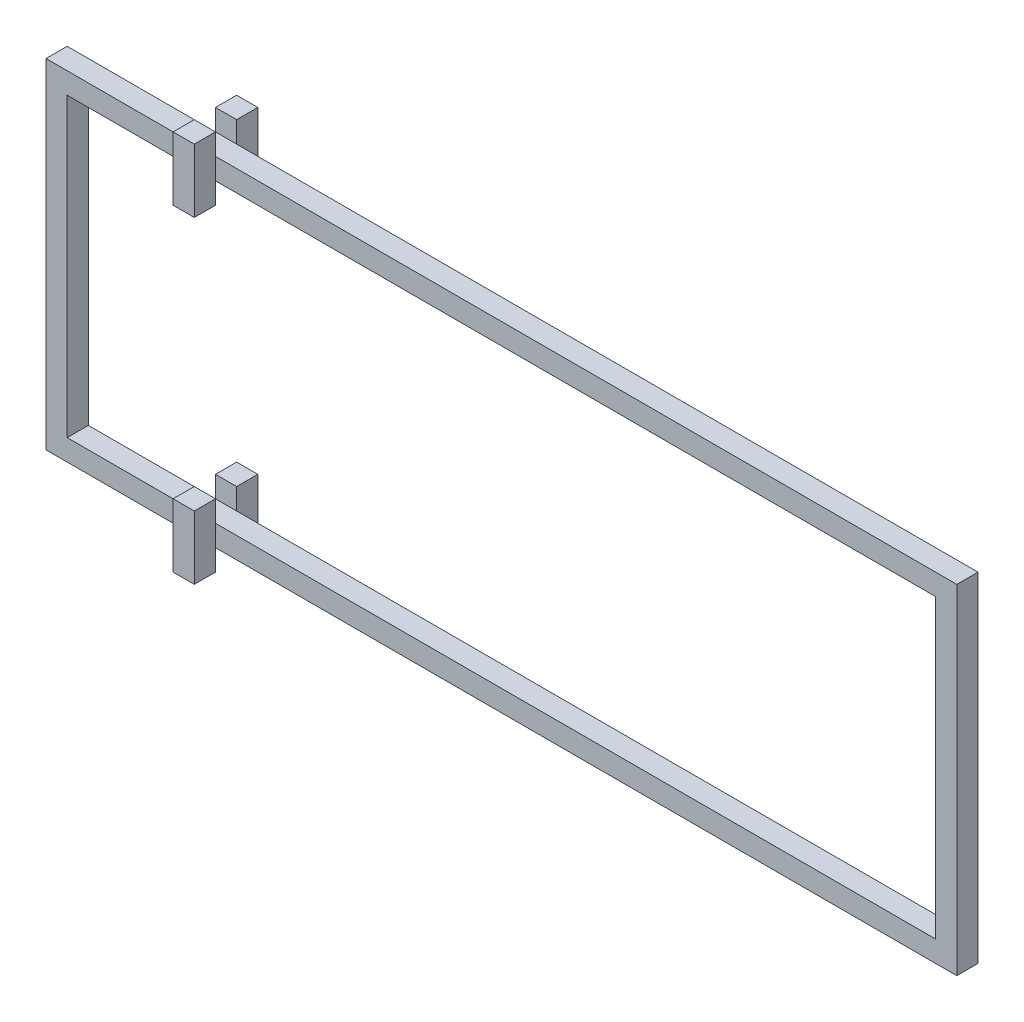
ISO-10303-21;
HEADER;
FILE_DESCRIPTION(('STEP AP214'),'2;1');
FILE_NAME('part.step','',(''),(''),'','','');
FILE_SCHEMA(('AUTOMOTIVE_DESIGN { 1 0 10303 214 1 1 1 1 }'));
ENDSEC;
DATA;
#1=APPLICATION_CONTEXT('core data for automotive mechanical design processes');
#2=APPLICATION_PROTOCOL_DEFINITION('international standard','automotive_design',2000,#1);
#3=PRODUCT_CONTEXT('',#1,'mechanical');
#4=PRODUCT('Part','Part','',(#3));
#5=PRODUCT_RELATED_PRODUCT_CATEGORY('part','',(#4));
#6=PRODUCT_DEFINITION_FORMATION('','',#4);
#7=PRODUCT_DEFINITION_CONTEXT('part definition',#1,'design');
#8=PRODUCT_DEFINITION('design','',#6,#7);
#9=PRODUCT_DEFINITION_SHAPE('','',#8);
#10=(LENGTH_UNIT() NAMED_UNIT(*) SI_UNIT(.MILLI.,.METRE.));
#11=(NAMED_UNIT(*) PLANE_ANGLE_UNIT() SI_UNIT($,.RADIAN.));
#12=(NAMED_UNIT(*) SI_UNIT($,.STERADIAN.) SOLID_ANGLE_UNIT());
#13=UNCERTAINTY_MEASURE_WITH_UNIT(LENGTH_MEASURE(1.E-05),#10,'distance_accuracy_value','');
#14=(GEOMETRIC_REPRESENTATION_CONTEXT(3) GLOBAL_UNCERTAINTY_ASSIGNED_CONTEXT((#13)) GLOBAL_UNIT_ASSIGNED_CONTEXT((#10,
#11,#12)) REPRESENTATION_CONTEXT('',''));
#15=CARTESIAN_POINT('',(0.,0.,0.));
#16=DIRECTION('',(0.,0.,1.));
#17=DIRECTION('',(1.,0.,0.));
#18=AXIS2_PLACEMENT_3D('',#15,#16,#17);
#19=CARTESIAN_POINT('',(-106.68,38.1,2.54));
#20=DIRECTION('',(0.,-1.,0.));
#21=DIRECTION('',(0.,0.,-1.));
#22=AXIS2_PLACEMENT_3D('',#19,#20,#21);
#23=PLANE('',#22);
#24=DIRECTION('',(-1.,0.,0.));
#25=VECTOR('',#24,1.);
#26=CARTESIAN_POINT('',(-106.68,38.1,2.54));
#27=LINE('',#26,#25);
#28=CARTESIAN_POINT('',(-2.54,38.1,2.54));
#29=VERTEX_POINT('',#28);
#30=CARTESIAN_POINT('',(-88.9,38.1,2.54));
#31=VERTEX_POINT('',#30);
#32=EDGE_CURVE('E534',#29,#31,#27,.T.);
#33=ORIENTED_EDGE('',*,*,#32,.T.);
#34=DIRECTION('',(1.,0.,0.));
#35=VECTOR('',#34,1.);
#36=CARTESIAN_POINT('',(-88.9,38.1,2.54));
#37=LINE('',#36,#35);
#38=CARTESIAN_POINT('',(-91.44,38.1,2.54));
#39=VERTEX_POINT('',#38);
#40=EDGE_CURVE('E366',#39,#31,#37,.T.);
#41=ORIENTED_EDGE('',*,*,#40,.F.);
#42=CARTESIAN_POINT('',(-106.68,38.1,2.54));
#43=VERTEX_POINT('',#42);
#44=EDGE_CURVE('E533',#39,#43,#27,.T.);
#45=ORIENTED_EDGE('',*,*,#44,.T.);
#46=DIRECTION('',(0.,0.,-1.));
#47=VECTOR('',#46,1.);
#48=CARTESIAN_POINT('',(-106.68,38.1,2.54));
#49=LINE('',#48,#47);
#50=CARTESIAN_POINT('',(-106.68,38.1,0.));
#51=VERTEX_POINT('',#50);
#52=EDGE_CURVE('E538',#43,#51,#49,.T.);
#53=ORIENTED_EDGE('',*,*,#52,.T.);
#54=DIRECTION('',(-1.,0.,0.));
#55=VECTOR('',#54,1.);
#56=CARTESIAN_POINT('',(-106.68,38.1,0.));
#57=LINE('',#56,#55);
#58=CARTESIAN_POINT('',(-91.44,38.1,0.));
#59=VERTEX_POINT('',#58);
#60=EDGE_CURVE('E551',#59,#51,#57,.T.);
#61=ORIENTED_EDGE('',*,*,#60,.F.);
#62=DIRECTION('',(-1.,0.,0.));
#63=VECTOR('',#62,1.);
#64=CARTESIAN_POINT('',(-88.9,38.1,0.));
#65=LINE('',#64,#63);
#66=CARTESIAN_POINT('',(-88.9,38.1,0.));
#67=VERTEX_POINT('',#66);
#68=EDGE_CURVE('E392',#67,#59,#65,.T.);
#69=ORIENTED_EDGE('',*,*,#68,.F.);
#70=CARTESIAN_POINT('',(-2.54,38.1,0.));
#71=VERTEX_POINT('',#70);
#72=EDGE_CURVE('E525',#71,#67,#57,.T.);
#73=ORIENTED_EDGE('',*,*,#72,.F.);
#74=DIRECTION('',(0.,0.,-1.));
#75=VECTOR('',#74,1.);
#76=CARTESIAN_POINT('',(-2.54,38.1,2.54));
#77=LINE('',#76,#75);
#78=EDGE_CURVE('E558',#29,#71,#77,.T.);
#79=ORIENTED_EDGE('',*,*,#78,.F.);
#80=EDGE_LOOP('',(#33,#41,#45,#53,#61,#69,#73,#79));
#81=FACE_BOUND('',#80,.T.);
#82=ADVANCED_FACE('F39',(#81),#23,.T.);
#83=CARTESIAN_POINT('',(0.,40.64,2.54));
#84=DIRECTION('',(0.,-1.,0.));
#85=DIRECTION('',(1.,0.,0.));
#86=AXIS2_PLACEMENT_3D('',#83,#84,#85);
#87=PLANE('',#86);
#88=DIRECTION('',(-1.,0.,0.));
#89=VECTOR('',#88,1.);
#90=CARTESIAN_POINT('',(-91.44,40.64,2.54));
#91=LINE('',#90,#89);
#92=CARTESIAN_POINT('',(-88.9,40.64,2.54));
#93=VERTEX_POINT('',#92);
#94=CARTESIAN_POINT('',(-91.44,40.64,2.54));
#95=VERTEX_POINT('',#94);
#96=EDGE_CURVE('E417',#93,#95,#91,.T.);
#97=ORIENTED_EDGE('',*,*,#96,.F.);
#98=DIRECTION('',(-1.,0.,0.));
#99=VECTOR('',#98,1.);
#100=CARTESIAN_POINT('',(0.,40.64,2.54));
#101=LINE('',#100,#99);
#102=CARTESIAN_POINT('',(0.,40.64,2.54));
#103=VERTEX_POINT('',#102);
#104=EDGE_CURVE('E576',#103,#93,#101,.T.);
#105=ORIENTED_EDGE('',*,*,#104,.F.);
#106=DIRECTION('',(0.,0.,-1.));
#107=VECTOR('',#106,1.);
#108=CARTESIAN_POINT('',(0.,40.64,2.54));
#109=LINE('',#108,#107);
#110=CARTESIAN_POINT('',(0.,40.64,0.));
#111=VERTEX_POINT('',#110);
#112=EDGE_CURVE('E11',#103,#111,#109,.T.);
#113=ORIENTED_EDGE('',*,*,#112,.T.);
#114=DIRECTION('',(-1.,0.,0.));
#115=VECTOR('',#114,1.);
#116=CARTESIAN_POINT('',(0.,40.64,0.));
#117=LINE('',#116,#115);
#118=CARTESIAN_POINT('',(-88.9,40.64,0.));
#119=VERTEX_POINT('',#118);
#120=EDGE_CURVE('E593',#111,#119,#117,.T.);
#121=ORIENTED_EDGE('',*,*,#120,.T.);
#122=DIRECTION('',(1.,0.,0.));
#123=VECTOR('',#122,1.);
#124=CARTESIAN_POINT('',(-91.44,40.64,0.));
#125=LINE('',#124,#123);
#126=CARTESIAN_POINT('',(-91.44,40.64,0.));
#127=VERTEX_POINT('',#126);
#128=EDGE_CURVE('E443',#127,#119,#125,.T.);
#129=ORIENTED_EDGE('',*,*,#128,.F.);
#130=CARTESIAN_POINT('',(-109.22,40.64,0.));
#131=VERTEX_POINT('',#130);
#132=EDGE_CURVE('E592',#127,#131,#117,.T.);
#133=ORIENTED_EDGE('',*,*,#132,.T.);
#134=DIRECTION('',(0.,0.,-1.));
#135=VECTOR('',#134,1.);
#136=CARTESIAN_POINT('',(-109.22,40.64,2.54));
#137=LINE('',#136,#135);
#138=CARTESIAN_POINT('',(-109.22,40.64,2.54));
#139=VERTEX_POINT('',#138);
#140=EDGE_CURVE('E48',#139,#131,#137,.T.);
#141=ORIENTED_EDGE('',*,*,#140,.F.);
#142=EDGE_CURVE('E574',#95,#139,#101,.T.);
#143=ORIENTED_EDGE('',*,*,#142,.F.);
#144=EDGE_LOOP('',(#97,#105,#113,#121,#129,#133,#141,#143));
#145=FACE_BOUND('',#144,.T.);
#146=ADVANCED_FACE('F658',(#145),#87,.F.);
#147=CARTESIAN_POINT('',(0.,0.,2.54));
#148=DIRECTION('',(0.,0.,1.));
#149=DIRECTION('',(1.,0.,0.));
#150=AXIS2_PLACEMENT_3D('',#147,#148,#149);
#151=PLANE('',#150);
#152=DIRECTION('',(0.,1.,0.));
#153=VECTOR('',#152,1.);
#154=CARTESIAN_POINT('',(-91.44,0.,2.54));
#155=LINE('',#154,#153);
#156=CARTESIAN_POINT('',(-91.44,0.,2.54));
#157=VERTEX_POINT('',#156);
#158=CARTESIAN_POINT('',(-91.44,2.53999999999999,2.54));
#159=VERTEX_POINT('',#158);
#160=EDGE_CURVE('E470',#157,#159,#155,.T.);
#161=ORIENTED_EDGE('',*,*,#160,.T.);
#162=DIRECTION('',(1.,0.,0.));
#163=VECTOR('',#162,1.);
#164=CARTESIAN_POINT('',(-106.68,2.53999999999999,2.54));
#165=LINE('',#164,#163);
#166=CARTESIAN_POINT('',(-106.68,2.53999999999999,2.54));
#167=VERTEX_POINT('',#166);
#168=EDGE_CURVE('E526',#167,#159,#165,.T.);
#169=ORIENTED_EDGE('',*,*,#168,.F.);
#170=DIRECTION('',(0.,-1.,0.));
#171=VECTOR('',#170,1.);
#172=CARTESIAN_POINT('',(-106.68,38.1,2.54));
#173=LINE('',#172,#171);
#174=EDGE_CURVE('E521',#43,#167,#173,.T.);
#175=ORIENTED_EDGE('',*,*,#174,.F.);
#176=ORIENTED_EDGE('',*,*,#44,.F.);
#177=DIRECTION('',(0.,1.,0.));
#178=VECTOR('',#177,1.);
#179=CARTESIAN_POINT('',(-91.44,38.1,2.54));
#180=LINE('',#179,#178);
#181=EDGE_CURVE('E63',#39,#95,#180,.T.);
#182=ORIENTED_EDGE('',*,*,#181,.T.);
#183=ORIENTED_EDGE('',*,*,#142,.T.);
#184=DIRECTION('',(0.,-1.,0.));
#185=VECTOR('',#184,1.);
#186=CARTESIAN_POINT('',(-109.22,0.,2.54));
#187=LINE('',#186,#185);
#188=CARTESIAN_POINT('',(-109.22,0.,2.54));
#189=VERTEX_POINT('',#188);
#190=EDGE_CURVE('E580',#139,#189,#187,.T.);
#191=ORIENTED_EDGE('',*,*,#190,.T.);
#192=DIRECTION('',(1.,0.,0.));
#193=VECTOR('',#192,1.);
#194=CARTESIAN_POINT('',(0.,0.,2.54));
#195=LINE('',#194,#193);
#196=EDGE_CURVE('E584',#189,#157,#195,.T.);
#197=ORIENTED_EDGE('',*,*,#196,.T.);
#198=EDGE_LOOP('',(#161,#169,#175,#176,#182,#183,#191,#197));
#199=FACE_BOUND('',#198,.T.);
#200=ADVANCED_FACE('F632',(#199),#151,.T.);
#201=DIRECTION('',(0.,-1.,0.));
#202=VECTOR('',#201,1.);
#203=CARTESIAN_POINT('',(-88.9,0.,2.54));
#204=LINE('',#203,#202);
#205=CARTESIAN_POINT('',(-88.9,2.53999999999999,2.54));
#206=VERTEX_POINT('',#205);
#207=CARTESIAN_POINT('',(-88.9,0.,2.54));
#208=VERTEX_POINT('',#207);
#209=EDGE_CURVE('E257',#206,#208,#204,.T.);
#210=ORIENTED_EDGE('',*,*,#209,.T.);
#211=CARTESIAN_POINT('',(0.,0.,2.54));
#212=VERTEX_POINT('',#211);
#213=EDGE_CURVE('E583',#208,#212,#195,.T.);
#214=ORIENTED_EDGE('',*,*,#213,.T.);
#215=DIRECTION('',(0.,1.,0.));
#216=VECTOR('',#215,1.);
#217=CARTESIAN_POINT('',(0.,0.,2.54));
#218=LINE('',#217,#216);
#219=EDGE_CURVE('E570',#212,#103,#218,.T.);
#220=ORIENTED_EDGE('',*,*,#219,.T.);
#221=ORIENTED_EDGE('',*,*,#104,.T.);
#222=DIRECTION('',(0.,-1.,0.));
#223=VECTOR('',#222,1.);
#224=CARTESIAN_POINT('',(-88.9,38.1,2.54));
#225=LINE('',#224,#223);
#226=EDGE_CURVE('E477',#93,#31,#225,.T.);
#227=ORIENTED_EDGE('',*,*,#226,.T.);
#228=ORIENTED_EDGE('',*,*,#32,.F.);
#229=DIRECTION('',(0.,1.,0.));
#230=VECTOR('',#229,1.);
#231=CARTESIAN_POINT('',(-2.54,38.1,2.54));
#232=LINE('',#231,#230);
#233=CARTESIAN_POINT('',(-2.54,2.53999999999999,2.54));
#234=VERTEX_POINT('',#233);
#235=EDGE_CURVE('E529',#234,#29,#232,.T.);
#236=ORIENTED_EDGE('',*,*,#235,.F.);
#237=EDGE_CURVE('E524',#206,#234,#165,.T.);
#238=ORIENTED_EDGE('',*,*,#237,.F.);
#239=EDGE_LOOP('',(#210,#214,#220,#221,#227,#228,#236,#238));
#240=FACE_BOUND('',#239,.T.);
#241=ADVANCED_FACE('F680',(#240),#151,.T.);
#242=CARTESIAN_POINT('',(0.,0.,0.));
#243=DIRECTION('',(0.,0.,1.));
#244=DIRECTION('',(1.,0.,0.));
#245=AXIS2_PLACEMENT_3D('',#242,#243,#244);
#246=PLANE('',#245);
#247=DIRECTION('',(0.,1.,0.));
#248=VECTOR('',#247,1.);
#249=CARTESIAN_POINT('',(-91.44,0.,0.));
#250=LINE('',#249,#248);
#251=CARTESIAN_POINT('',(-91.44,0.,0.));
#252=VERTEX_POINT('',#251);
#253=CARTESIAN_POINT('',(-91.44,2.54,0.));
#254=VERTEX_POINT('',#253);
#255=EDGE_CURVE('E488',#252,#254,#250,.T.);
#256=ORIENTED_EDGE('',*,*,#255,.F.);
#257=DIRECTION('',(1.,0.,0.));
#258=VECTOR('',#257,1.);
#259=CARTESIAN_POINT('',(0.,0.,0.));
#260=LINE('',#259,#258);
#261=CARTESIAN_POINT('',(-109.22,0.,0.));
#262=VERTEX_POINT('',#261);
#263=EDGE_CURVE('E575',#262,#252,#260,.T.);
#264=ORIENTED_EDGE('',*,*,#263,.F.);
#265=DIRECTION('',(0.,-1.,0.));
#266=VECTOR('',#265,1.);
#267=CARTESIAN_POINT('',(-109.22,0.,0.));
#268=LINE('',#267,#266);
#269=EDGE_CURVE('E596',#131,#262,#268,.T.);
#270=ORIENTED_EDGE('',*,*,#269,.F.);
#271=ORIENTED_EDGE('',*,*,#132,.F.);
#272=DIRECTION('',(0.,1.,0.));
#273=VECTOR('',#272,1.);
#274=CARTESIAN_POINT('',(-91.44,38.1,0.));
#275=LINE('',#274,#273);
#276=EDGE_CURVE('E511',#59,#127,#275,.T.);
#277=ORIENTED_EDGE('',*,*,#276,.F.);
#278=ORIENTED_EDGE('',*,*,#60,.T.);
#279=DIRECTION('',(0.,-1.,0.));
#280=VECTOR('',#279,1.);
#281=CARTESIAN_POINT('',(-106.68,38.1,0.));
#282=LINE('',#281,#280);
#283=CARTESIAN_POINT('',(-106.68,2.53999999999999,0.));
#284=VERTEX_POINT('',#283);
#285=EDGE_CURVE('E514',#51,#284,#282,.T.);
#286=ORIENTED_EDGE('',*,*,#285,.T.);
#287=DIRECTION('',(1.,0.,0.));
#288=VECTOR('',#287,1.);
#289=CARTESIAN_POINT('',(-106.68,2.53999999999999,0.));
#290=LINE('',#289,#288);
#291=EDGE_CURVE('E543',#284,#254,#290,.T.);
#292=ORIENTED_EDGE('',*,*,#291,.T.);
#293=EDGE_LOOP('',(#256,#264,#270,#271,#277,#278,#286,#292));
#294=FACE_BOUND('',#293,.T.);
#295=ADVANCED_FACE('F622',(#294),#246,.F.);
#296=DIRECTION('',(0.,-1.,0.));
#297=VECTOR('',#296,1.);
#298=CARTESIAN_POINT('',(-88.9,0.,0.));
#299=LINE('',#298,#297);
#300=CARTESIAN_POINT('',(-88.9,2.54,0.));
#301=VERTEX_POINT('',#300);
#302=CARTESIAN_POINT('',(-88.9,0.,0.));
#303=VERTEX_POINT('',#302);
#304=EDGE_CURVE('E497',#301,#303,#299,.T.);
#305=ORIENTED_EDGE('',*,*,#304,.F.);
#306=CARTESIAN_POINT('',(-2.54,2.53999999999999,0.));
#307=VERTEX_POINT('',#306);
#308=EDGE_CURVE('E542',#301,#307,#290,.T.);
#309=ORIENTED_EDGE('',*,*,#308,.T.);
#310=DIRECTION('',(0.,1.,0.));
#311=VECTOR('',#310,1.);
#312=CARTESIAN_POINT('',(-2.54,38.1,0.));
#313=LINE('',#312,#311);
#314=EDGE_CURVE('E547',#307,#71,#313,.T.);
#315=ORIENTED_EDGE('',*,*,#314,.T.);
#316=ORIENTED_EDGE('',*,*,#72,.T.);
#317=DIRECTION('',(0.,-1.,0.));
#318=VECTOR('',#317,1.);
#319=CARTESIAN_POINT('',(-88.9,38.1,0.));
#320=LINE('',#319,#318);
#321=EDGE_CURVE('E500',#119,#67,#320,.T.);
#322=ORIENTED_EDGE('',*,*,#321,.F.);
#323=ORIENTED_EDGE('',*,*,#120,.F.);
#324=DIRECTION('',(0.,1.,0.));
#325=VECTOR('',#324,1.);
#326=CARTESIAN_POINT('',(0.,0.,0.));
#327=LINE('',#326,#325);
#328=CARTESIAN_POINT('',(0.,0.,0.));
#329=VERTEX_POINT('',#328);
#330=EDGE_CURVE('E569',#329,#111,#327,.T.);
#331=ORIENTED_EDGE('',*,*,#330,.F.);
#332=EDGE_CURVE('E599',#303,#329,#260,.T.);
#333=ORIENTED_EDGE('',*,*,#332,.F.);
#334=EDGE_LOOP('',(#305,#309,#315,#316,#322,#323,#331,#333));
#335=FACE_BOUND('',#334,.T.);
#336=ADVANCED_FACE('F686',(#335),#246,.F.);
#337=CARTESIAN_POINT('',(0.,0.,2.54));
#338=DIRECTION('',(-1.,0.,0.));
#339=DIRECTION('',(0.,0.,1.));
#340=AXIS2_PLACEMENT_3D('',#337,#338,#339);
#341=PLANE('',#340);
#342=ORIENTED_EDGE('',*,*,#330,.T.);
#343=ORIENTED_EDGE('',*,*,#112,.F.);
#344=ORIENTED_EDGE('',*,*,#219,.F.);
#345=DIRECTION('',(0.,0.,-1.));
#346=VECTOR('',#345,1.);
#347=CARTESIAN_POINT('',(0.,0.,2.54));
#348=LINE('',#347,#346);
#349=EDGE_CURVE('E588',#212,#329,#348,.T.);
#350=ORIENTED_EDGE('',*,*,#349,.T.);
#351=EDGE_LOOP('',(#342,#343,#344,#350));
#352=FACE_BOUND('',#351,.T.);
#353=ADVANCED_FACE('F41',(#352),#341,.F.);
#354=CARTESIAN_POINT('',(-109.22,0.,2.54));
#355=DIRECTION('',(1.,0.,0.));
#356=DIRECTION('',(0.,0.,-1.));
#357=AXIS2_PLACEMENT_3D('',#354,#355,#356);
#358=PLANE('',#357);
#359=ORIENTED_EDGE('',*,*,#269,.T.);
#360=DIRECTION('',(0.,0.,-1.));
#361=VECTOR('',#360,1.);
#362=CARTESIAN_POINT('',(-109.22,0.,2.54));
#363=LINE('',#362,#361);
#364=EDGE_CURVE('E606',#189,#262,#363,.T.);
#365=ORIENTED_EDGE('',*,*,#364,.F.);
#366=ORIENTED_EDGE('',*,*,#190,.F.);
#367=ORIENTED_EDGE('',*,*,#140,.T.);
#368=EDGE_LOOP('',(#359,#365,#366,#367));
#369=FACE_BOUND('',#368,.T.);
#370=ADVANCED_FACE('F615',(#369),#358,.F.);
#371=CARTESIAN_POINT('',(0.,0.,2.54));
#372=DIRECTION('',(0.,1.,0.));
#373=DIRECTION('',(0.,0.,1.));
#374=AXIS2_PLACEMENT_3D('',#371,#372,#373);
#375=PLANE('',#374);
#376=ORIENTED_EDGE('',*,*,#213,.F.);
#377=DIRECTION('',(-1.,0.,0.));
#378=VECTOR('',#377,1.);
#379=CARTESIAN_POINT('',(-91.44,0.,2.54));
#380=LINE('',#379,#378);
#381=EDGE_CURVE('E314',#208,#157,#380,.T.);
#382=ORIENTED_EDGE('',*,*,#381,.T.);
#383=ORIENTED_EDGE('',*,*,#196,.F.);
#384=ORIENTED_EDGE('',*,*,#364,.T.);
#385=ORIENTED_EDGE('',*,*,#263,.T.);
#386=DIRECTION('',(1.,0.,0.));
#387=VECTOR('',#386,1.);
#388=CARTESIAN_POINT('',(-91.44,0.,0.));
#389=LINE('',#388,#387);
#390=EDGE_CURVE('E340',#252,#303,#389,.T.);
#391=ORIENTED_EDGE('',*,*,#390,.T.);
#392=ORIENTED_EDGE('',*,*,#332,.T.);
#393=ORIENTED_EDGE('',*,*,#349,.F.);
#394=EDGE_LOOP('',(#376,#382,#383,#384,#385,#391,#392,#393));
#395=FACE_BOUND('',#394,.T.);
#396=ADVANCED_FACE('F626',(#395),#375,.F.);
#397=CARTESIAN_POINT('',(-106.68,38.1,2.54));
#398=DIRECTION('',(1.,0.,0.));
#399=DIRECTION('',(0.,0.,-1.));
#400=AXIS2_PLACEMENT_3D('',#397,#398,#399);
#401=PLANE('',#400);
#402=ORIENTED_EDGE('',*,*,#285,.F.);
#403=ORIENTED_EDGE('',*,*,#52,.F.);
#404=ORIENTED_EDGE('',*,*,#174,.T.);
#405=DIRECTION('',(0.,0.,-1.));
#406=VECTOR('',#405,1.);
#407=CARTESIAN_POINT('',(-106.68,2.53999999999999,2.54));
#408=LINE('',#407,#406);
#409=EDGE_CURVE('E565',#167,#284,#408,.T.);
#410=ORIENTED_EDGE('',*,*,#409,.T.);
#411=EDGE_LOOP('',(#402,#403,#404,#410));
#412=FACE_BOUND('',#411,.T.);
#413=ADVANCED_FACE('F676',(#412),#401,.T.);
#414=CARTESIAN_POINT('',(-106.68,2.53999999999999,2.54));
#415=DIRECTION('',(0.,1.,0.));
#416=DIRECTION('',(-1.,0.,0.));
#417=AXIS2_PLACEMENT_3D('',#414,#415,#416);
#418=PLANE('',#417);
#419=DIRECTION('',(1.,0.,0.));
#420=VECTOR('',#419,1.);
#421=CARTESIAN_POINT('',(-88.9,2.54,2.54));
#422=LINE('',#421,#420);
#423=EDGE_CURVE('E55',#159,#206,#422,.T.);
#424=ORIENTED_EDGE('',*,*,#423,.T.);
#425=ORIENTED_EDGE('',*,*,#237,.T.);
#426=DIRECTION('',(0.,0.,-1.));
#427=VECTOR('',#426,1.);
#428=CARTESIAN_POINT('',(-2.54,2.53999999999999,2.54));
#429=LINE('',#428,#427);
#430=EDGE_CURVE('E561',#234,#307,#429,.T.);
#431=ORIENTED_EDGE('',*,*,#430,.T.);
#432=ORIENTED_EDGE('',*,*,#308,.F.);
#433=DIRECTION('',(-1.,0.,0.));
#434=VECTOR('',#433,1.);
#435=CARTESIAN_POINT('',(-88.9,2.54,0.));
#436=LINE('',#435,#434);
#437=EDGE_CURVE('E262',#301,#254,#436,.T.);
#438=ORIENTED_EDGE('',*,*,#437,.T.);
#439=ORIENTED_EDGE('',*,*,#291,.F.);
#440=ORIENTED_EDGE('',*,*,#409,.F.);
#441=ORIENTED_EDGE('',*,*,#168,.T.);
#442=EDGE_LOOP('',(#424,#425,#431,#432,#438,#439,#440,#441));
#443=FACE_BOUND('',#442,.T.);
#444=ADVANCED_FACE('F672',(#443),#418,.T.);
#445=CARTESIAN_POINT('',(-2.54,38.1,2.54));
#446=DIRECTION('',(-1.,0.,0.));
#447=DIRECTION('',(0.,0.,1.));
#448=AXIS2_PLACEMENT_3D('',#445,#446,#447);
#449=PLANE('',#448);
#450=ORIENTED_EDGE('',*,*,#314,.F.);
#451=ORIENTED_EDGE('',*,*,#430,.F.);
#452=ORIENTED_EDGE('',*,*,#235,.T.);
#453=ORIENTED_EDGE('',*,*,#78,.T.);
#454=EDGE_LOOP('',(#450,#451,#452,#453));
#455=FACE_BOUND('',#454,.T.);
#456=ADVANCED_FACE('F669',(#455),#449,.T.);
#457=CARTESIAN_POINT('',(-88.9,38.1,-2.54));
#458=DIRECTION('',(-1.,0.,0.));
#459=DIRECTION('',(0.,0.,1.));
#460=AXIS2_PLACEMENT_3D('',#457,#458,#459);
#461=PLANE('',#460);
#462=ORIENTED_EDGE('',*,*,#321,.T.);
#463=DIRECTION('',(0.,1.,0.));
#464=VECTOR('',#463,1.);
#465=CARTESIAN_POINT('',(-88.9,35.56,0.));
#466=LINE('',#465,#464);
#467=CARTESIAN_POINT('',(-88.9,35.56,0.));
#468=VERTEX_POINT('',#467);
#469=EDGE_CURVE('E414',#468,#67,#466,.T.);
#470=ORIENTED_EDGE('',*,*,#469,.F.);
#471=DIRECTION('',(0.,0.,1.));
#472=VECTOR('',#471,1.);
#473=CARTESIAN_POINT('',(-88.9,35.56,-2.54));
#474=LINE('',#473,#472);
#475=CARTESIAN_POINT('',(-88.9,35.56,-2.54));
#476=VERTEX_POINT('',#475);
#477=EDGE_CURVE('E393',#476,#468,#474,.T.);
#478=ORIENTED_EDGE('',*,*,#477,.F.);
#479=DIRECTION('',(0.,-1.,0.));
#480=VECTOR('',#479,1.);
#481=CARTESIAN_POINT('',(-88.9,38.1,-2.54));
#482=LINE('',#481,#480);
#483=CARTESIAN_POINT('',(-88.9,43.18,-2.54));
#484=VERTEX_POINT('',#483);
#485=EDGE_CURVE('E507',#484,#476,#482,.T.);
#486=ORIENTED_EDGE('',*,*,#485,.F.);
#487=DIRECTION('',(0.,0.,-1.));
#488=VECTOR('',#487,1.);
#489=CARTESIAN_POINT('',(-88.9,43.18,-2.54));
#490=LINE('',#489,#488);
#491=CARTESIAN_POINT('',(-88.9,43.18,0.));
#492=VERTEX_POINT('',#491);
#493=EDGE_CURVE('E451',#492,#484,#490,.T.);
#494=ORIENTED_EDGE('',*,*,#493,.F.);
#495=DIRECTION('',(0.,-1.,0.));
#496=VECTOR('',#495,1.);
#497=CARTESIAN_POINT('',(-88.9,43.18,0.));
#498=LINE('',#497,#496);
#499=EDGE_CURVE('E459',#492,#119,#498,.T.);
#500=ORIENTED_EDGE('',*,*,#499,.T.);
#501=EDGE_LOOP('',(#462,#470,#478,#486,#494,#500));
#502=FACE_BOUND('',#501,.T.);
#503=ADVANCED_FACE('F667',(#502),#461,.F.);
#504=CARTESIAN_POINT('',(-91.44,38.1,-2.54));
#505=DIRECTION('',(1.,0.,0.));
#506=DIRECTION('',(0.,0.,-1.));
#507=AXIS2_PLACEMENT_3D('',#504,#505,#506);
#508=PLANE('',#507);
#509=ORIENTED_EDGE('',*,*,#276,.T.);
#510=DIRECTION('',(0.,-1.,0.));
#511=VECTOR('',#510,1.);
#512=CARTESIAN_POINT('',(-91.44,43.18,0.));
#513=LINE('',#512,#511);
#514=CARTESIAN_POINT('',(-91.44,43.18,0.));
#515=VERTEX_POINT('',#514);
#516=EDGE_CURVE('E466',#515,#127,#513,.T.);
#517=ORIENTED_EDGE('',*,*,#516,.F.);
#518=DIRECTION('',(0.,0.,1.));
#519=VECTOR('',#518,1.);
#520=CARTESIAN_POINT('',(-91.44,43.18,-2.54));
#521=LINE('',#520,#519);
#522=CARTESIAN_POINT('',(-91.44,43.18,-2.54));
#523=VERTEX_POINT('',#522);
#524=EDGE_CURVE('E444',#523,#515,#521,.T.);
#525=ORIENTED_EDGE('',*,*,#524,.F.);
#526=DIRECTION('',(0.,1.,0.));
#527=VECTOR('',#526,1.);
#528=CARTESIAN_POINT('',(-91.44,38.1,-2.54));
#529=LINE('',#528,#527);
#530=CARTESIAN_POINT('',(-91.44,35.56,-2.54));
#531=VERTEX_POINT('',#530);
#532=EDGE_CURVE('E510',#531,#523,#529,.T.);
#533=ORIENTED_EDGE('',*,*,#532,.F.);
#534=DIRECTION('',(0.,0.,-1.));
#535=VECTOR('',#534,1.);
#536=CARTESIAN_POINT('',(-91.44,35.56,-2.54));
#537=LINE('',#536,#535);
#538=CARTESIAN_POINT('',(-91.44,35.56,0.));
#539=VERTEX_POINT('',#538);
#540=EDGE_CURVE('E400',#539,#531,#537,.T.);
#541=ORIENTED_EDGE('',*,*,#540,.F.);
#542=DIRECTION('',(0.,1.,0.));
#543=VECTOR('',#542,1.);
#544=CARTESIAN_POINT('',(-91.44,35.56,0.));
#545=LINE('',#544,#543);
#546=EDGE_CURVE('E408',#539,#59,#545,.T.);
#547=ORIENTED_EDGE('',*,*,#546,.T.);
#548=EDGE_LOOP('',(#509,#517,#525,#533,#541,#547));
#549=FACE_BOUND('',#548,.T.);
#550=ADVANCED_FACE('F728',(#549),#508,.F.);
#551=CARTESIAN_POINT('',(0.,0.,-2.54));
#552=DIRECTION('',(0.,0.,1.));
#553=DIRECTION('',(1.,0.,0.));
#554=AXIS2_PLACEMENT_3D('',#551,#552,#553);
#555=PLANE('',#554);
#556=ORIENTED_EDGE('',*,*,#485,.T.);
#557=DIRECTION('',(1.,0.,0.));
#558=VECTOR('',#557,1.);
#559=CARTESIAN_POINT('',(-88.9,35.56,-2.54));
#560=LINE('',#559,#558);
#561=EDGE_CURVE('E404',#531,#476,#560,.T.);
#562=ORIENTED_EDGE('',*,*,#561,.F.);
#563=ORIENTED_EDGE('',*,*,#532,.T.);
#564=DIRECTION('',(-1.,0.,0.));
#565=VECTOR('',#564,1.);
#566=CARTESIAN_POINT('',(-91.44,43.18,-2.54));
#567=LINE('',#566,#565);
#568=EDGE_CURVE('E455',#484,#523,#567,.T.);
#569=ORIENTED_EDGE('',*,*,#568,.F.);
#570=EDGE_LOOP('',(#556,#562,#563,#569));
#571=FACE_BOUND('',#570,.T.);
#572=ADVANCED_FACE('F804',(#571),#555,.F.);
#573=CARTESIAN_POINT('',(-91.44,0.,-2.54));
#574=DIRECTION('',(1.,0.,0.));
#575=DIRECTION('',(0.,0.,-1.));
#576=AXIS2_PLACEMENT_3D('',#573,#574,#575);
#577=PLANE('',#576);
#578=ORIENTED_EDGE('',*,*,#255,.T.);
#579=DIRECTION('',(0.,-1.,0.));
#580=VECTOR('',#579,1.);
#581=CARTESIAN_POINT('',(-91.44,5.08,0.));
#582=LINE('',#581,#580);
#583=CARTESIAN_POINT('',(-91.44,5.08,0.));
#584=VERTEX_POINT('',#583);
#585=EDGE_CURVE('E311',#584,#254,#582,.T.);
#586=ORIENTED_EDGE('',*,*,#585,.F.);
#587=DIRECTION('',(0.,0.,-1.));
#588=VECTOR('',#587,1.);
#589=CARTESIAN_POINT('',(-91.44,5.08,-2.54));
#590=LINE('',#589,#588);
#591=CARTESIAN_POINT('',(-91.44,5.08,-2.54));
#592=VERTEX_POINT('',#591);
#593=EDGE_CURVE('E297',#584,#592,#590,.T.);
#594=ORIENTED_EDGE('',*,*,#593,.T.);
#595=DIRECTION('',(0.,1.,0.));
#596=VECTOR('',#595,1.);
#597=CARTESIAN_POINT('',(-91.44,0.,-2.54));
#598=LINE('',#597,#596);
#599=CARTESIAN_POINT('',(-91.44,-2.54,-2.54));
#600=VERTEX_POINT('',#599);
#601=EDGE_CURVE('E493',#600,#592,#598,.T.);
#602=ORIENTED_EDGE('',*,*,#601,.F.);
#603=DIRECTION('',(0.,0.,1.));
#604=VECTOR('',#603,1.);
#605=CARTESIAN_POINT('',(-91.44,-2.54,-2.54));
#606=LINE('',#605,#604);
#607=CARTESIAN_POINT('',(-91.44,-2.54,0.));
#608=VERTEX_POINT('',#607);
#609=EDGE_CURVE('E341',#600,#608,#606,.T.);
#610=ORIENTED_EDGE('',*,*,#609,.T.);
#611=DIRECTION('',(0.,1.,0.));
#612=VECTOR('',#611,1.);
#613=CARTESIAN_POINT('',(-91.44,-2.54,0.));
#614=LINE('',#613,#612);
#615=EDGE_CURVE('E357',#608,#252,#614,.T.);
#616=ORIENTED_EDGE('',*,*,#615,.T.);
#617=EDGE_LOOP('',(#578,#586,#594,#602,#610,#616));
#618=FACE_BOUND('',#617,.T.);
#619=ADVANCED_FACE('F736',(#618),#577,.F.);
#620=CARTESIAN_POINT('',(-88.9,0.,-2.54));
#621=DIRECTION('',(-1.,0.,0.));
#622=DIRECTION('',(0.,0.,1.));
#623=AXIS2_PLACEMENT_3D('',#620,#621,#622);
#624=PLANE('',#623);
#625=ORIENTED_EDGE('',*,*,#304,.T.);
#626=DIRECTION('',(0.,1.,0.));
#627=VECTOR('',#626,1.);
#628=CARTESIAN_POINT('',(-88.9,-2.54,0.));
#629=LINE('',#628,#627);
#630=CARTESIAN_POINT('',(-88.9,-2.54,0.));
#631=VERTEX_POINT('',#630);
#632=EDGE_CURVE('E363',#631,#303,#629,.T.);
#633=ORIENTED_EDGE('',*,*,#632,.F.);
#634=DIRECTION('',(0.,0.,-1.));
#635=VECTOR('',#634,1.);
#636=CARTESIAN_POINT('',(-88.9,-2.54,-2.54));
#637=LINE('',#636,#635);
#638=CARTESIAN_POINT('',(-88.9,-2.54,-2.54));
#639=VERTEX_POINT('',#638);
#640=EDGE_CURVE('E349',#631,#639,#637,.T.);
#641=ORIENTED_EDGE('',*,*,#640,.T.);
#642=DIRECTION('',(0.,-1.,0.));
#643=VECTOR('',#642,1.);
#644=CARTESIAN_POINT('',(-88.9,0.,-2.54));
#645=LINE('',#644,#643);
#646=CARTESIAN_POINT('',(-88.9,5.08,-2.54));
#647=VERTEX_POINT('',#646);
#648=EDGE_CURVE('E496',#647,#639,#645,.T.);
#649=ORIENTED_EDGE('',*,*,#648,.F.);
#650=DIRECTION('',(0.,0.,1.));
#651=VECTOR('',#650,1.);
#652=CARTESIAN_POINT('',(-88.9,5.08,-2.54));
#653=LINE('',#652,#651);
#654=CARTESIAN_POINT('',(-88.9,5.08,0.));
#655=VERTEX_POINT('',#654);
#656=EDGE_CURVE('E289',#647,#655,#653,.T.);
#657=ORIENTED_EDGE('',*,*,#656,.T.);
#658=DIRECTION('',(0.,-1.,0.));
#659=VECTOR('',#658,1.);
#660=CARTESIAN_POINT('',(-88.9,5.08,0.));
#661=LINE('',#660,#659);
#662=EDGE_CURVE('E305',#655,#301,#661,.T.);
#663=ORIENTED_EDGE('',*,*,#662,.T.);
#664=EDGE_LOOP('',(#625,#633,#641,#649,#657,#663));
#665=FACE_BOUND('',#664,.T.);
#666=ADVANCED_FACE('F744',(#665),#624,.F.);
#667=CARTESIAN_POINT('',(0.,0.,-2.54));
#668=DIRECTION('',(0.,0.,-1.));
#669=DIRECTION('',(-1.,0.,0.));
#670=AXIS2_PLACEMENT_3D('',#667,#668,#669);
#671=PLANE('',#670);
#672=ORIENTED_EDGE('',*,*,#601,.T.);
#673=DIRECTION('',(1.,0.,0.));
#674=VECTOR('',#673,1.);
#675=CARTESIAN_POINT('',(-88.9,5.08,-2.54));
#676=LINE('',#675,#674);
#677=EDGE_CURVE('E293',#592,#647,#676,.T.);
#678=ORIENTED_EDGE('',*,*,#677,.T.);
#679=ORIENTED_EDGE('',*,*,#648,.T.);
#680=DIRECTION('',(-1.,0.,0.));
#681=VECTOR('',#680,1.);
#682=CARTESIAN_POINT('',(-91.44,-2.54,-2.54));
#683=LINE('',#682,#681);
#684=EDGE_CURVE('E345',#639,#600,#683,.T.);
#685=ORIENTED_EDGE('',*,*,#684,.T.);
#686=EDGE_LOOP('',(#672,#678,#679,#685));
#687=FACE_BOUND('',#686,.T.);
#688=ADVANCED_FACE('F749',(#687),#671,.T.);
#689=CARTESIAN_POINT('',(-88.9,38.1,5.08));
#690=DIRECTION('',(1.,0.,0.));
#691=DIRECTION('',(0.,0.,-1.));
#692=AXIS2_PLACEMENT_3D('',#689,#690,#691);
#693=PLANE('',#692);
#694=ORIENTED_EDGE('',*,*,#226,.F.);
#695=DIRECTION('',(0.,-1.,0.));
#696=VECTOR('',#695,1.);
#697=CARTESIAN_POINT('',(-88.9,43.18,2.54));
#698=LINE('',#697,#696);
#699=CARTESIAN_POINT('',(-88.9,43.18,2.54));
#700=VERTEX_POINT('',#699);
#701=EDGE_CURVE('E439',#700,#93,#698,.T.);
#702=ORIENTED_EDGE('',*,*,#701,.F.);
#703=DIRECTION('',(0.,0.,-1.));
#704=VECTOR('',#703,1.);
#705=CARTESIAN_POINT('',(-88.9,43.18,5.07999999999999));
#706=LINE('',#705,#704);
#707=CARTESIAN_POINT('',(-88.9,43.18,5.07999999999999));
#708=VERTEX_POINT('',#707);
#709=EDGE_CURVE('E426',#708,#700,#706,.T.);
#710=ORIENTED_EDGE('',*,*,#709,.F.);
#711=DIRECTION('',(0.,-1.,0.));
#712=VECTOR('',#711,1.);
#713=CARTESIAN_POINT('',(-88.9,38.1,5.08));
#714=LINE('',#713,#712);
#715=CARTESIAN_POINT('',(-88.9,35.56,5.08));
#716=VERTEX_POINT('',#715);
#717=EDGE_CURVE('E482',#708,#716,#714,.T.);
#718=ORIENTED_EDGE('',*,*,#717,.T.);
#719=DIRECTION('',(0.,0.,1.));
#720=VECTOR('',#719,1.);
#721=CARTESIAN_POINT('',(-88.9,35.56,5.08));
#722=LINE('',#721,#720);
#723=CARTESIAN_POINT('',(-88.9,35.56,2.54));
#724=VERTEX_POINT('',#723);
#725=EDGE_CURVE('E367',#724,#716,#722,.T.);
#726=ORIENTED_EDGE('',*,*,#725,.F.);
#727=DIRECTION('',(0.,1.,0.));
#728=VECTOR('',#727,1.);
#729=CARTESIAN_POINT('',(-88.9,35.56,2.54));
#730=LINE('',#729,#728);
#731=EDGE_CURVE('E381',#724,#31,#730,.T.);
#732=ORIENTED_EDGE('',*,*,#731,.T.);
#733=EDGE_LOOP('',(#694,#702,#710,#718,#726,#732));
#734=FACE_BOUND('',#733,.T.);
#735=ADVANCED_FACE('F818',(#734),#693,.T.);
#736=CARTESIAN_POINT('',(-91.44,38.1,5.08));
#737=DIRECTION('',(-1.,0.,0.));
#738=DIRECTION('',(0.,0.,1.));
#739=AXIS2_PLACEMENT_3D('',#736,#737,#738);
#740=PLANE('',#739);
#741=ORIENTED_EDGE('',*,*,#181,.F.);
#742=DIRECTION('',(0.,1.,0.));
#743=VECTOR('',#742,1.);
#744=CARTESIAN_POINT('',(-91.44,35.56,2.54));
#745=LINE('',#744,#743);
#746=CARTESIAN_POINT('',(-91.44,35.56,2.54));
#747=VERTEX_POINT('',#746);
#748=EDGE_CURVE('E388',#747,#39,#745,.T.);
#749=ORIENTED_EDGE('',*,*,#748,.F.);
#750=DIRECTION('',(0.,0.,-1.));
#751=VECTOR('',#750,1.);
#752=CARTESIAN_POINT('',(-91.44,35.56,5.08));
#753=LINE('',#752,#751);
#754=CARTESIAN_POINT('',(-91.44,35.56,5.08));
#755=VERTEX_POINT('',#754);
#756=EDGE_CURVE('E375',#755,#747,#753,.T.);
#757=ORIENTED_EDGE('',*,*,#756,.F.);
#758=DIRECTION('',(0.,1.,0.));
#759=VECTOR('',#758,1.);
#760=CARTESIAN_POINT('',(-91.44,38.1,5.08));
#761=LINE('',#760,#759);
#762=CARTESIAN_POINT('',(-91.44,43.18,5.07999999999999));
#763=VERTEX_POINT('',#762);
#764=EDGE_CURVE('E485',#755,#763,#761,.T.);
#765=ORIENTED_EDGE('',*,*,#764,.T.);
#766=DIRECTION('',(0.,0.,1.));
#767=VECTOR('',#766,1.);
#768=CARTESIAN_POINT('',(-91.44,43.18,5.07999999999999));
#769=LINE('',#768,#767);
#770=CARTESIAN_POINT('',(-91.44,43.18,2.54));
#771=VERTEX_POINT('',#770);
#772=EDGE_CURVE('E418',#771,#763,#769,.T.);
#773=ORIENTED_EDGE('',*,*,#772,.F.);
#774=DIRECTION('',(0.,-1.,0.));
#775=VECTOR('',#774,1.);
#776=CARTESIAN_POINT('',(-91.44,43.18,2.54));
#777=LINE('',#776,#775);
#778=EDGE_CURVE('E432',#771,#95,#777,.T.);
#779=ORIENTED_EDGE('',*,*,#778,.T.);
#780=EDGE_LOOP('',(#741,#749,#757,#765,#773,#779));
#781=FACE_BOUND('',#780,.T.);
#782=ADVANCED_FACE('F821',(#781),#740,.T.);
#783=CARTESIAN_POINT('',(0.,0.,5.08));
#784=DIRECTION('',(0.,0.,-1.));
#785=DIRECTION('',(1.,0.,0.));
#786=AXIS2_PLACEMENT_3D('',#783,#784,#785);
#787=PLANE('',#786);
#788=ORIENTED_EDGE('',*,*,#717,.F.);
#789=DIRECTION('',(1.,0.,0.));
#790=VECTOR('',#789,1.);
#791=CARTESIAN_POINT('',(-91.44,43.18,5.07999999999999));
#792=LINE('',#791,#790);
#793=EDGE_CURVE('E422',#763,#708,#792,.T.);
#794=ORIENTED_EDGE('',*,*,#793,.F.);
#795=ORIENTED_EDGE('',*,*,#764,.F.);
#796=DIRECTION('',(-1.,0.,0.));
#797=VECTOR('',#796,1.);
#798=CARTESIAN_POINT('',(-88.9,35.56,5.08));
#799=LINE('',#798,#797);
#800=EDGE_CURVE('E371',#716,#755,#799,.T.);
#801=ORIENTED_EDGE('',*,*,#800,.F.);
#802=EDGE_LOOP('',(#788,#794,#795,#801));
#803=FACE_BOUND('',#802,.T.);
#804=ADVANCED_FACE('F825',(#803),#787,.F.);
#805=CARTESIAN_POINT('',(-91.44,0.,5.08));
#806=DIRECTION('',(-1.,0.,0.));
#807=DIRECTION('',(0.,0.,1.));
#808=AXIS2_PLACEMENT_3D('',#805,#806,#807);
#809=PLANE('',#808);
#810=ORIENTED_EDGE('',*,*,#160,.F.);
#811=DIRECTION('',(0.,1.,0.));
#812=VECTOR('',#811,1.);
#813=CARTESIAN_POINT('',(-91.44,-2.54,2.54));
#814=LINE('',#813,#812);
#815=CARTESIAN_POINT('',(-91.44,-2.54,2.54));
#816=VERTEX_POINT('',#815);
#817=EDGE_CURVE('E336',#816,#157,#814,.T.);
#818=ORIENTED_EDGE('',*,*,#817,.F.);
#819=DIRECTION('',(0.,0.,1.));
#820=VECTOR('',#819,1.);
#821=CARTESIAN_POINT('',(-91.44,-2.54,5.07999999999999));
#822=LINE('',#821,#820);
#823=CARTESIAN_POINT('',(-91.44,-2.54,5.07999999999999));
#824=VERTEX_POINT('',#823);
#825=EDGE_CURVE('E315',#816,#824,#822,.T.);
#826=ORIENTED_EDGE('',*,*,#825,.T.);
#827=DIRECTION('',(0.,1.,0.));
#828=VECTOR('',#827,1.);
#829=CARTESIAN_POINT('',(-91.44,0.,5.08));
#830=LINE('',#829,#828);
#831=CARTESIAN_POINT('',(-91.44,5.08,5.08));
#832=VERTEX_POINT('',#831);
#833=EDGE_CURVE('E471',#824,#832,#830,.T.);
#834=ORIENTED_EDGE('',*,*,#833,.T.);
#835=DIRECTION('',(0.,0.,-1.));
#836=VECTOR('',#835,1.);
#837=CARTESIAN_POINT('',(-91.44,5.08,5.08));
#838=LINE('',#837,#836);
#839=CARTESIAN_POINT('',(-91.44,5.08,2.54));
#840=VERTEX_POINT('',#839);
#841=EDGE_CURVE('E278',#832,#840,#838,.T.);
#842=ORIENTED_EDGE('',*,*,#841,.T.);
#843=DIRECTION('',(0.,-1.,0.));
#844=VECTOR('',#843,1.);
#845=CARTESIAN_POINT('',(-91.44,5.08,2.54));
#846=LINE('',#845,#844);
#847=EDGE_CURVE('E263',#840,#159,#846,.T.);
#848=ORIENTED_EDGE('',*,*,#847,.T.);
#849=EDGE_LOOP('',(#810,#818,#826,#834,#842,#848));
#850=FACE_BOUND('',#849,.T.);
#851=ADVANCED_FACE('F639',(#850),#809,.T.);
#852=CARTESIAN_POINT('',(-88.9,0.,5.08));
#853=DIRECTION('',(1.,0.,0.));
#854=DIRECTION('',(0.,0.,-1.));
#855=AXIS2_PLACEMENT_3D('',#852,#853,#854);
#856=PLANE('',#855);
#857=ORIENTED_EDGE('',*,*,#209,.F.);
#858=DIRECTION('',(0.,-1.,0.));
#859=VECTOR('',#858,1.);
#860=CARTESIAN_POINT('',(-88.9,5.08,2.54));
#861=LINE('',#860,#859);
#862=CARTESIAN_POINT('',(-88.9,5.08,2.54));
#863=VERTEX_POINT('',#862);
#864=EDGE_CURVE('E251',#863,#206,#861,.T.);
#865=ORIENTED_EDGE('',*,*,#864,.F.);
#866=DIRECTION('',(0.,0.,1.));
#867=VECTOR('',#866,1.);
#868=CARTESIAN_POINT('',(-88.9,5.08,5.08));
#869=LINE('',#868,#867);
#870=CARTESIAN_POINT('',(-88.9,5.08,5.08));
#871=VERTEX_POINT('',#870);
#872=EDGE_CURVE('E254',#863,#871,#869,.T.);
#873=ORIENTED_EDGE('',*,*,#872,.T.);
#874=DIRECTION('',(0.,-1.,0.));
#875=VECTOR('',#874,1.);
#876=CARTESIAN_POINT('',(-88.9,0.,5.08));
#877=LINE('',#876,#875);
#878=CARTESIAN_POINT('',(-88.9,-2.54,5.07999999999999));
#879=VERTEX_POINT('',#878);
#880=EDGE_CURVE('E474',#871,#879,#877,.T.);
#881=ORIENTED_EDGE('',*,*,#880,.T.);
#882=DIRECTION('',(0.,0.,-1.));
#883=VECTOR('',#882,1.);
#884=CARTESIAN_POINT('',(-88.9,-2.54,5.07999999999999));
#885=LINE('',#884,#883);
#886=CARTESIAN_POINT('',(-88.9,-2.54,2.54));
#887=VERTEX_POINT('',#886);
#888=EDGE_CURVE('E323',#879,#887,#885,.T.);
#889=ORIENTED_EDGE('',*,*,#888,.T.);
#890=DIRECTION('',(0.,1.,0.));
#891=VECTOR('',#890,1.);
#892=CARTESIAN_POINT('',(-88.9,-2.54,2.54));
#893=LINE('',#892,#891);
#894=EDGE_CURVE('E331',#887,#208,#893,.T.);
#895=ORIENTED_EDGE('',*,*,#894,.T.);
#896=EDGE_LOOP('',(#857,#865,#873,#881,#889,#895));
#897=FACE_BOUND('',#896,.T.);
#898=ADVANCED_FACE('F253',(#897),#856,.T.);
#899=CARTESIAN_POINT('',(0.,0.,5.08));
#900=DIRECTION('',(0.,0.,1.));
#901=DIRECTION('',(-1.,0.,0.));
#902=AXIS2_PLACEMENT_3D('',#899,#900,#901);
#903=PLANE('',#902);
#904=ORIENTED_EDGE('',*,*,#833,.F.);
#905=DIRECTION('',(1.,0.,0.));
#906=VECTOR('',#905,1.);
#907=CARTESIAN_POINT('',(-91.44,-2.54,5.07999999999999));
#908=LINE('',#907,#906);
#909=EDGE_CURVE('E327',#824,#879,#908,.T.);
#910=ORIENTED_EDGE('',*,*,#909,.T.);
#911=ORIENTED_EDGE('',*,*,#880,.F.);
#912=DIRECTION('',(-1.,0.,0.));
#913=VECTOR('',#912,1.);
#914=CARTESIAN_POINT('',(-88.9,5.08,5.08));
#915=LINE('',#914,#913);
#916=EDGE_CURVE('E272',#871,#832,#915,.T.);
#917=ORIENTED_EDGE('',*,*,#916,.T.);
#918=EDGE_LOOP('',(#904,#910,#911,#917));
#919=FACE_BOUND('',#918,.T.);
#920=ADVANCED_FACE('F645',(#919),#903,.T.);
#921=CARTESIAN_POINT('',(-91.44,43.18,0.));
#922=DIRECTION('',(0.,0.,-1.));
#923=DIRECTION('',(-1.,0.,0.));
#924=AXIS2_PLACEMENT_3D('',#921,#922,#923);
#925=PLANE('',#924);
#926=ORIENTED_EDGE('',*,*,#128,.T.);
#927=ORIENTED_EDGE('',*,*,#499,.F.);
#928=DIRECTION('',(1.,0.,0.));
#929=VECTOR('',#928,1.);
#930=CARTESIAN_POINT('',(-91.44,43.18,0.));
#931=LINE('',#930,#929);
#932=EDGE_CURVE('E448',#515,#492,#931,.T.);
#933=ORIENTED_EDGE('',*,*,#932,.F.);
#934=ORIENTED_EDGE('',*,*,#516,.T.);
#935=EDGE_LOOP('',(#926,#927,#933,#934));
#936=FACE_BOUND('',#935,.T.);
#937=ADVANCED_FACE('F647',(#936),#925,.F.);
#938=CARTESIAN_POINT('',(0.,43.18,0.));
#939=DIRECTION('',(0.,1.,0.));
#940=DIRECTION('',(0.,0.,1.));
#941=AXIS2_PLACEMENT_3D('',#938,#939,#940);
#942=PLANE('',#941);
#943=ORIENTED_EDGE('',*,*,#524,.T.);
#944=ORIENTED_EDGE('',*,*,#932,.T.);
#945=ORIENTED_EDGE('',*,*,#493,.T.);
#946=ORIENTED_EDGE('',*,*,#568,.T.);
#947=EDGE_LOOP('',(#943,#944,#945,#946));
#948=FACE_BOUND('',#947,.T.);
#949=ADVANCED_FACE('F653',(#948),#942,.T.);
#950=CARTESIAN_POINT('',(-91.44,43.18,2.54));
#951=DIRECTION('',(0.,0.,1.));
#952=DIRECTION('',(1.,0.,0.));
#953=AXIS2_PLACEMENT_3D('',#950,#951,#952);
#954=PLANE('',#953);
#955=ORIENTED_EDGE('',*,*,#96,.T.);
#956=ORIENTED_EDGE('',*,*,#778,.F.);
#957=DIRECTION('',(-1.,0.,0.));
#958=VECTOR('',#957,1.);
#959=CARTESIAN_POINT('',(-91.44,43.18,2.54));
#960=LINE('',#959,#958);
#961=EDGE_CURVE('E429',#700,#771,#960,.T.);
#962=ORIENTED_EDGE('',*,*,#961,.F.);
#963=ORIENTED_EDGE('',*,*,#701,.T.);
#964=EDGE_LOOP('',(#955,#956,#962,#963));
#965=FACE_BOUND('',#964,.T.);
#966=ADVANCED_FACE('F793',(#965),#954,.F.);
#967=CARTESIAN_POINT('',(0.,43.18,0.));
#968=DIRECTION('',(0.,-1.,0.));
#969=DIRECTION('',(0.,0.,-1.));
#970=AXIS2_PLACEMENT_3D('',#967,#968,#969);
#971=PLANE('',#970);
#972=ORIENTED_EDGE('',*,*,#772,.T.);
#973=ORIENTED_EDGE('',*,*,#793,.T.);
#974=ORIENTED_EDGE('',*,*,#709,.T.);
#975=ORIENTED_EDGE('',*,*,#961,.T.);
#976=EDGE_LOOP('',(#972,#973,#974,#975));
#977=FACE_BOUND('',#976,.T.);
#978=ADVANCED_FACE('F789',(#977),#971,.F.);
#979=CARTESIAN_POINT('',(-88.9,35.56,0.));
#980=DIRECTION('',(0.,0.,-1.));
#981=DIRECTION('',(-1.,0.,0.));
#982=AXIS2_PLACEMENT_3D('',#979,#980,#981);
#983=PLANE('',#982);
#984=ORIENTED_EDGE('',*,*,#68,.T.);
#985=ORIENTED_EDGE('',*,*,#546,.F.);
#986=DIRECTION('',(-1.,0.,0.));
#987=VECTOR('',#986,1.);
#988=CARTESIAN_POINT('',(-88.9,35.56,0.));
#989=LINE('',#988,#987);
#990=EDGE_CURVE('E397',#468,#539,#989,.T.);
#991=ORIENTED_EDGE('',*,*,#990,.F.);
#992=ORIENTED_EDGE('',*,*,#469,.T.);
#993=EDGE_LOOP('',(#984,#985,#991,#992));
#994=FACE_BOUND('',#993,.T.);
#995=ADVANCED_FACE('F785',(#994),#983,.F.);
#996=CARTESIAN_POINT('',(0.,35.56,0.));
#997=DIRECTION('',(0.,-1.,0.));
#998=DIRECTION('',(0.,0.,-1.));
#999=AXIS2_PLACEMENT_3D('',#996,#997,#998);
#1000=PLANE('',#999);
#1001=ORIENTED_EDGE('',*,*,#477,.T.);
#1002=ORIENTED_EDGE('',*,*,#990,.T.);
#1003=ORIENTED_EDGE('',*,*,#540,.T.);
#1004=ORIENTED_EDGE('',*,*,#561,.T.);
#1005=EDGE_LOOP('',(#1001,#1002,#1003,#1004));
#1006=FACE_BOUND('',#1005,.T.);
#1007=ADVANCED_FACE('F781',(#1006),#1000,.T.);
#1008=CARTESIAN_POINT('',(-88.9,35.56,2.54));
#1009=DIRECTION('',(0.,0.,1.));
#1010=DIRECTION('',(1.,0.,0.));
#1011=AXIS2_PLACEMENT_3D('',#1008,#1009,#1010);
#1012=PLANE('',#1011);
#1013=ORIENTED_EDGE('',*,*,#40,.T.);
#1014=ORIENTED_EDGE('',*,*,#731,.F.);
#1015=DIRECTION('',(1.,0.,0.));
#1016=VECTOR('',#1015,1.);
#1017=CARTESIAN_POINT('',(-88.9,35.56,2.54));
#1018=LINE('',#1017,#1016);
#1019=EDGE_CURVE('E378',#747,#724,#1018,.T.);
#1020=ORIENTED_EDGE('',*,*,#1019,.F.);
#1021=ORIENTED_EDGE('',*,*,#748,.T.);
#1022=EDGE_LOOP('',(#1013,#1014,#1020,#1021));
#1023=FACE_BOUND('',#1022,.T.);
#1024=ADVANCED_FACE('F777',(#1023),#1012,.F.);
#1025=CARTESIAN_POINT('',(0.,35.56,0.));
#1026=DIRECTION('',(0.,1.,0.));
#1027=DIRECTION('',(0.,0.,1.));
#1028=AXIS2_PLACEMENT_3D('',#1025,#1026,#1027);
#1029=PLANE('',#1028);
#1030=ORIENTED_EDGE('',*,*,#725,.T.);
#1031=ORIENTED_EDGE('',*,*,#800,.T.);
#1032=ORIENTED_EDGE('',*,*,#756,.T.);
#1033=ORIENTED_EDGE('',*,*,#1019,.T.);
#1034=EDGE_LOOP('',(#1030,#1031,#1032,#1033));
#1035=FACE_BOUND('',#1034,.T.);
#1036=ADVANCED_FACE('F774',(#1035),#1029,.F.);
#1037=CARTESIAN_POINT('',(-91.44,-2.54,0.));
#1038=DIRECTION('',(0.,0.,1.));
#1039=DIRECTION('',(1.,0.,0.));
#1040=AXIS2_PLACEMENT_3D('',#1037,#1038,#1039);
#1041=PLANE('',#1040);
#1042=ORIENTED_EDGE('',*,*,#390,.F.);
#1043=ORIENTED_EDGE('',*,*,#615,.F.);
#1044=DIRECTION('',(1.,0.,0.));
#1045=VECTOR('',#1044,1.);
#1046=CARTESIAN_POINT('',(-91.44,-2.54,0.));
#1047=LINE('',#1046,#1045);
#1048=EDGE_CURVE('E353',#608,#631,#1047,.T.);
#1049=ORIENTED_EDGE('',*,*,#1048,.T.);
#1050=ORIENTED_EDGE('',*,*,#632,.T.);
#1051=EDGE_LOOP('',(#1042,#1043,#1049,#1050));
#1052=FACE_BOUND('',#1051,.T.);
#1053=ADVANCED_FACE('F741',(#1052),#1041,.T.);
#1054=CARTESIAN_POINT('',(0.,-2.53999999999999,0.));
#1055=DIRECTION('',(0.,-1.,0.));
#1056=DIRECTION('',(0.,0.,1.));
#1057=AXIS2_PLACEMENT_3D('',#1054,#1055,#1056);
#1058=PLANE('',#1057);
#1059=ORIENTED_EDGE('',*,*,#609,.F.);
#1060=ORIENTED_EDGE('',*,*,#684,.F.);
#1061=ORIENTED_EDGE('',*,*,#640,.F.);
#1062=ORIENTED_EDGE('',*,*,#1048,.F.);
#1063=EDGE_LOOP('',(#1059,#1060,#1061,#1062));
#1064=FACE_BOUND('',#1063,.T.);
#1065=ADVANCED_FACE('F747',(#1064),#1058,.T.);
#1066=CARTESIAN_POINT('',(-91.44,-2.54,2.54));
#1067=DIRECTION('',(0.,0.,-1.));
#1068=DIRECTION('',(-1.,0.,0.));
#1069=AXIS2_PLACEMENT_3D('',#1066,#1067,#1068);
#1070=PLANE('',#1069);
#1071=ORIENTED_EDGE('',*,*,#381,.F.);
#1072=ORIENTED_EDGE('',*,*,#894,.F.);
#1073=DIRECTION('',(-1.,0.,0.));
#1074=VECTOR('',#1073,1.);
#1075=CARTESIAN_POINT('',(-91.44,-2.54,2.54));
#1076=LINE('',#1075,#1074);
#1077=EDGE_CURVE('E319',#887,#816,#1076,.T.);
#1078=ORIENTED_EDGE('',*,*,#1077,.T.);
#1079=ORIENTED_EDGE('',*,*,#817,.T.);
#1080=EDGE_LOOP('',(#1071,#1072,#1078,#1079));
#1081=FACE_BOUND('',#1080,.T.);
#1082=ADVANCED_FACE('F635',(#1081),#1070,.T.);
#1083=CARTESIAN_POINT('',(0.,-2.53999999999999,0.));
#1084=DIRECTION('',(0.,1.,0.));
#1085=DIRECTION('',(0.,0.,-1.));
#1086=AXIS2_PLACEMENT_3D('',#1083,#1084,#1085);
#1087=PLANE('',#1086);
#1088=ORIENTED_EDGE('',*,*,#825,.F.);
#1089=ORIENTED_EDGE('',*,*,#1077,.F.);
#1090=ORIENTED_EDGE('',*,*,#888,.F.);
#1091=ORIENTED_EDGE('',*,*,#909,.F.);
#1092=EDGE_LOOP('',(#1088,#1089,#1090,#1091));
#1093=FACE_BOUND('',#1092,.T.);
#1094=ADVANCED_FACE('F642',(#1093),#1087,.F.);
#1095=CARTESIAN_POINT('',(-88.9,5.08,0.));
#1096=DIRECTION('',(0.,0.,1.));
#1097=DIRECTION('',(1.,0.,0.));
#1098=AXIS2_PLACEMENT_3D('',#1095,#1096,#1097);
#1099=PLANE('',#1098);
#1100=ORIENTED_EDGE('',*,*,#437,.F.);
#1101=ORIENTED_EDGE('',*,*,#662,.F.);
#1102=DIRECTION('',(-1.,0.,0.));
#1103=VECTOR('',#1102,1.);
#1104=CARTESIAN_POINT('',(-88.9,5.08,0.));
#1105=LINE('',#1104,#1103);
#1106=EDGE_CURVE('E301',#655,#584,#1105,.T.);
#1107=ORIENTED_EDGE('',*,*,#1106,.T.);
#1108=ORIENTED_EDGE('',*,*,#585,.T.);
#1109=EDGE_LOOP('',(#1100,#1101,#1107,#1108));
#1110=FACE_BOUND('',#1109,.T.);
#1111=ADVANCED_FACE('F757',(#1110),#1099,.T.);
#1112=CARTESIAN_POINT('',(0.,5.08000000000002,0.));
#1113=DIRECTION('',(0.,1.,0.));
#1114=DIRECTION('',(0.,0.,-1.));
#1115=AXIS2_PLACEMENT_3D('',#1112,#1113,#1114);
#1116=PLANE('',#1115);
#1117=ORIENTED_EDGE('',*,*,#656,.F.);
#1118=ORIENTED_EDGE('',*,*,#677,.F.);
#1119=ORIENTED_EDGE('',*,*,#593,.F.);
#1120=ORIENTED_EDGE('',*,*,#1106,.F.);
#1121=EDGE_LOOP('',(#1117,#1118,#1119,#1120));
#1122=FACE_BOUND('',#1121,.T.);
#1123=ADVANCED_FACE('F754',(#1122),#1116,.T.);
#1124=CARTESIAN_POINT('',(-88.9,5.08,2.54));
#1125=DIRECTION('',(0.,0.,-1.));
#1126=DIRECTION('',(-1.,0.,0.));
#1127=AXIS2_PLACEMENT_3D('',#1124,#1125,#1126);
#1128=PLANE('',#1127);
#1129=ORIENTED_EDGE('',*,*,#423,.F.);
#1130=ORIENTED_EDGE('',*,*,#847,.F.);
#1131=DIRECTION('',(1.,0.,0.));
#1132=VECTOR('',#1131,1.);
#1133=CARTESIAN_POINT('',(-88.9,5.08,2.54));
#1134=LINE('',#1133,#1132);
#1135=EDGE_CURVE('E269',#840,#863,#1134,.T.);
#1136=ORIENTED_EDGE('',*,*,#1135,.T.);
#1137=ORIENTED_EDGE('',*,*,#864,.T.);
#1138=EDGE_LOOP('',(#1129,#1130,#1136,#1137));
#1139=FACE_BOUND('',#1138,.T.);
#1140=ADVANCED_FACE('F275',(#1139),#1128,.T.);
#1141=CARTESIAN_POINT('',(0.,5.08000000000002,0.));
#1142=DIRECTION('',(0.,-1.,0.));
#1143=DIRECTION('',(0.,0.,1.));
#1144=AXIS2_PLACEMENT_3D('',#1141,#1142,#1143);
#1145=PLANE('',#1144);
#1146=ORIENTED_EDGE('',*,*,#872,.F.);
#1147=ORIENTED_EDGE('',*,*,#1135,.F.);
#1148=ORIENTED_EDGE('',*,*,#841,.F.);
#1149=ORIENTED_EDGE('',*,*,#916,.F.);
#1150=EDGE_LOOP('',(#1146,#1147,#1148,#1149));
#1151=FACE_BOUND('',#1150,.T.);
#1152=ADVANCED_FACE('F267',(#1151),#1145,.F.);
#1153=CLOSED_SHELL('',(#82,#146,#200,#241,#295,#336,#353,#370,#396,#413,#444,#456,#503,#550,
#572,#619,#666,#688,#735,#782,#804,#851,#898,#920,#937,#949,#966,#978,#995,#1007,#1024,#1036,
#1053,#1065,#1082,#1094,#1111,#1123,#1140,#1152));
#1154=MANIFOLD_SOLID_BREP('B2',#1153);
#1155=ADVANCED_BREP_SHAPE_REPRESENTATION('',(#18,#1154),#14);
#1156=SHAPE_DEFINITION_REPRESENTATION(#9,#1155);
ENDSEC;
END-ISO-10303-21;
